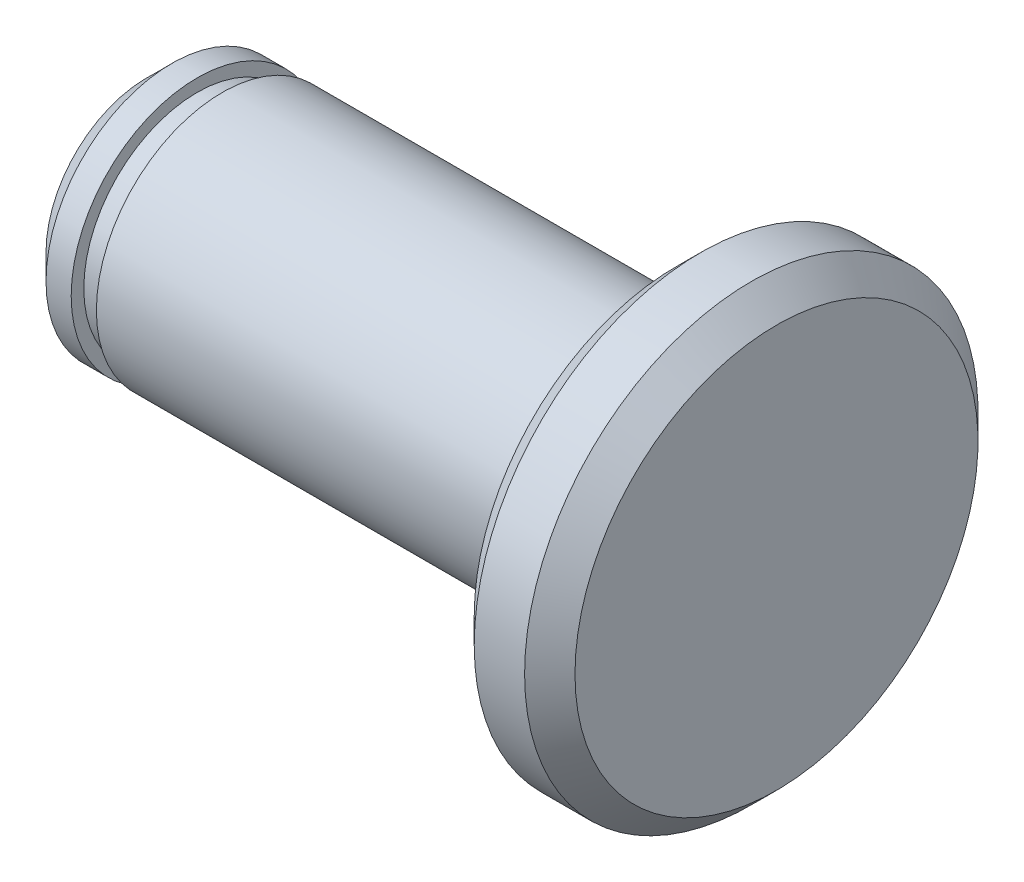
ISO-10303-21;
HEADER;
FILE_DESCRIPTION(('STEP AP214'),'2;1');
FILE_NAME('part.step','',(''),(''),'','','');
FILE_SCHEMA(('AUTOMOTIVE_DESIGN { 1 0 10303 214 1 1 1 1 }'));
ENDSEC;
DATA;
#1=APPLICATION_CONTEXT('core data for automotive mechanical design processes');
#2=APPLICATION_PROTOCOL_DEFINITION('international standard','automotive_design',2000,#1);
#3=PRODUCT_CONTEXT('',#1,'mechanical');
#4=PRODUCT('Part','Part','',(#3));
#5=PRODUCT_RELATED_PRODUCT_CATEGORY('part','',(#4));
#6=PRODUCT_DEFINITION_FORMATION('','',#4);
#7=PRODUCT_DEFINITION_CONTEXT('part definition',#1,'design');
#8=PRODUCT_DEFINITION('design','',#6,#7);
#9=PRODUCT_DEFINITION_SHAPE('','',#8);
#10=(LENGTH_UNIT() NAMED_UNIT(*) SI_UNIT(.MILLI.,.METRE.));
#11=(NAMED_UNIT(*) PLANE_ANGLE_UNIT() SI_UNIT($,.RADIAN.));
#12=(NAMED_UNIT(*) SI_UNIT($,.STERADIAN.) SOLID_ANGLE_UNIT());
#13=UNCERTAINTY_MEASURE_WITH_UNIT(LENGTH_MEASURE(1.E-05),#10,'distance_accuracy_value','');
#14=(GEOMETRIC_REPRESENTATION_CONTEXT(3) GLOBAL_UNCERTAINTY_ASSIGNED_CONTEXT((#13)) GLOBAL_UNIT_ASSIGNED_CONTEXT((#10,
#11,#12)) REPRESENTATION_CONTEXT('',''));
#15=CARTESIAN_POINT('',(0.,0.,0.));
#16=DIRECTION('',(0.,0.,1.));
#17=DIRECTION('',(1.,0.,0.));
#18=AXIS2_PLACEMENT_3D('',#15,#16,#17);
#19=CARTESIAN_POINT('',(-21.,0.,0.));
#20=DIRECTION('',(-1.,0.,0.));
#21=DIRECTION('',(0.,0.,1.));
#22=AXIS2_PLACEMENT_3D('',#19,#20,#21);
#23=PLANE('',#22);
#24=CARTESIAN_POINT('',(-21.,0.,0.));
#25=DIRECTION('',(-1.,0.,0.));
#26=DIRECTION('',(0.,0.,1.));
#27=AXIS2_PLACEMENT_3D('',#24,#25,#26);
#28=CIRCLE('',#27,4.);
#29=CARTESIAN_POINT('',(-21.,0.,4.));
#30=VERTEX_POINT('',#29);
#31=EDGE_CURVE('E10',#30,#30,#28,.T.);
#32=ORIENTED_EDGE('',*,*,#31,.T.);
#33=EDGE_LOOP('',(#32));
#34=FACE_BOUND('',#33,.T.);
#35=ADVANCED_FACE('F39',(#34),#23,.T.);
#36=CARTESIAN_POINT('',(-21.,0.,0.));
#37=DIRECTION('',(1.,0.,0.));
#38=DIRECTION('',(0.,0.,-1.));
#39=AXIS2_PLACEMENT_3D('',#36,#37,#38);
#40=CONICAL_SURFACE('',#39,4.,0.785398163397448);
#41=CARTESIAN_POINT('',(-20.,0.,0.));
#42=DIRECTION('',(-1.,0.,0.));
#43=DIRECTION('',(0.,0.,1.));
#44=AXIS2_PLACEMENT_3D('',#41,#42,#43);
#45=CIRCLE('',#44,5.);
#46=CARTESIAN_POINT('',(-20.,0.,5.));
#47=VERTEX_POINT('',#46);
#48=EDGE_CURVE('E45',#47,#47,#45,.T.);
#49=ORIENTED_EDGE('',*,*,#48,.T.);
#50=EDGE_LOOP('',(#49));
#51=FACE_BOUND('',#50,.T.);
#52=ORIENTED_EDGE('',*,*,#31,.F.);
#53=EDGE_LOOP('',(#52));
#54=FACE_BOUND('',#53,.T.);
#55=ADVANCED_FACE('F92',(#51,#54),#40,.T.);
#56=CARTESIAN_POINT('',(-21.,0.,0.));
#57=DIRECTION('',(-1.,0.,0.));
#58=DIRECTION('',(0.,0.,1.));
#59=AXIS2_PLACEMENT_3D('',#56,#57,#58);
#60=CYLINDRICAL_SURFACE('',#59,5.);
#61=CARTESIAN_POINT('',(-19.,0.,0.));
#62=DIRECTION('',(-1.,0.,0.));
#63=DIRECTION('',(0.,0.,1.));
#64=AXIS2_PLACEMENT_3D('',#61,#62,#63);
#65=CIRCLE('',#64,5.);
#66=CARTESIAN_POINT('',(-19.,0.,5.));
#67=VERTEX_POINT('',#66);
#68=EDGE_CURVE('E49',#67,#67,#65,.T.);
#69=ORIENTED_EDGE('',*,*,#68,.T.);
#70=EDGE_LOOP('',(#69));
#71=FACE_BOUND('',#70,.T.);
#72=ORIENTED_EDGE('',*,*,#48,.F.);
#73=EDGE_LOOP('',(#72));
#74=FACE_BOUND('',#73,.T.);
#75=ADVANCED_FACE('F96',(#71,#74),#60,.T.);
#76=CARTESIAN_POINT('',(-19.,0.,5.));
#77=DIRECTION('',(1.,0.,0.));
#78=DIRECTION('',(0.,0.,-1.));
#79=AXIS2_PLACEMENT_3D('',#76,#77,#78);
#80=PLANE('',#79);
#81=CARTESIAN_POINT('',(-19.,0.,0.));
#82=DIRECTION('',(-1.,0.,0.));
#83=DIRECTION('',(0.,0.,1.));
#84=AXIS2_PLACEMENT_3D('',#81,#82,#83);
#85=CIRCLE('',#84,4.5);
#86=CARTESIAN_POINT('',(-19.,0.,4.5));
#87=VERTEX_POINT('',#86);
#88=EDGE_CURVE('E53',#87,#87,#85,.T.);
#89=ORIENTED_EDGE('',*,*,#88,.T.);
#90=EDGE_LOOP('',(#89));
#91=FACE_BOUND('',#90,.T.);
#92=ORIENTED_EDGE('',*,*,#68,.F.);
#93=EDGE_LOOP('',(#92));
#94=FACE_BOUND('',#93,.T.);
#95=ADVANCED_FACE('F100',(#91,#94),#80,.T.);
#96=CARTESIAN_POINT('',(-21.,0.,0.));
#97=DIRECTION('',(-1.,0.,0.));
#98=DIRECTION('',(0.,0.,1.));
#99=AXIS2_PLACEMENT_3D('',#96,#97,#98);
#100=CYLINDRICAL_SURFACE('',#99,4.5);
#101=CARTESIAN_POINT('',(-18.,0.,0.));
#102=DIRECTION('',(-1.,0.,0.));
#103=DIRECTION('',(0.,0.,1.));
#104=AXIS2_PLACEMENT_3D('',#101,#102,#103);
#105=CIRCLE('',#104,4.5);
#106=CARTESIAN_POINT('',(-18.,0.,4.5));
#107=VERTEX_POINT('',#106);
#108=EDGE_CURVE('E58',#107,#107,#105,.T.);
#109=ORIENTED_EDGE('',*,*,#108,.T.);
#110=EDGE_LOOP('',(#109));
#111=FACE_BOUND('',#110,.T.);
#112=ORIENTED_EDGE('',*,*,#88,.F.);
#113=EDGE_LOOP('',(#112));
#114=FACE_BOUND('',#113,.T.);
#115=ADVANCED_FACE('F107',(#111,#114),#100,.T.);
#116=CARTESIAN_POINT('',(-18.,0.,4.5));
#117=DIRECTION('',(-1.,0.,0.));
#118=DIRECTION('',(0.,0.,1.));
#119=AXIS2_PLACEMENT_3D('',#116,#117,#118);
#120=PLANE('',#119);
#121=CARTESIAN_POINT('',(-18.,0.,0.));
#122=DIRECTION('',(-1.,0.,0.));
#123=DIRECTION('',(0.,0.,1.));
#124=AXIS2_PLACEMENT_3D('',#121,#122,#123);
#125=CIRCLE('',#124,5.);
#126=CARTESIAN_POINT('',(-18.,0.,5.));
#127=VERTEX_POINT('',#126);
#128=EDGE_CURVE('E61',#127,#127,#125,.T.);
#129=ORIENTED_EDGE('',*,*,#128,.T.);
#130=EDGE_LOOP('',(#129));
#131=FACE_BOUND('',#130,.T.);
#132=ORIENTED_EDGE('',*,*,#108,.F.);
#133=EDGE_LOOP('',(#132));
#134=FACE_BOUND('',#133,.T.);
#135=ADVANCED_FACE('F111',(#131,#134),#120,.T.);
#136=CARTESIAN_POINT('',(-21.,0.,0.));
#137=DIRECTION('',(-1.,0.,0.));
#138=DIRECTION('',(0.,0.,1.));
#139=AXIS2_PLACEMENT_3D('',#136,#137,#138);
#140=CYLINDRICAL_SURFACE('',#139,5.);
#141=CARTESIAN_POINT('',(0.,0.,0.));
#142=DIRECTION('',(-1.,0.,0.));
#143=DIRECTION('',(0.,0.,1.));
#144=AXIS2_PLACEMENT_3D('',#141,#142,#143);
#145=CIRCLE('',#144,5.);
#146=CARTESIAN_POINT('',(0.,0.,5.));
#147=VERTEX_POINT('',#146);
#148=EDGE_CURVE('E64',#147,#147,#145,.T.);
#149=ORIENTED_EDGE('',*,*,#148,.T.);
#150=EDGE_LOOP('',(#149));
#151=FACE_BOUND('',#150,.T.);
#152=ORIENTED_EDGE('',*,*,#128,.F.);
#153=EDGE_LOOP('',(#152));
#154=FACE_BOUND('',#153,.T.);
#155=ADVANCED_FACE('F115',(#151,#154),#140,.T.);
#156=CARTESIAN_POINT('',(0.,0.,8.));
#157=DIRECTION('',(-1.,0.,0.));
#158=DIRECTION('',(0.,0.,1.));
#159=AXIS2_PLACEMENT_3D('',#156,#157,#158);
#160=PLANE('',#159);
#161=CARTESIAN_POINT('',(0.,0.,0.));
#162=DIRECTION('',(-1.,0.,0.));
#163=DIRECTION('',(0.,0.,1.));
#164=AXIS2_PLACEMENT_3D('',#161,#162,#163);
#165=CIRCLE('',#164,8.);
#166=CARTESIAN_POINT('',(0.,0.,8.));
#167=VERTEX_POINT('',#166);
#168=EDGE_CURVE('E67',#167,#167,#165,.T.);
#169=ORIENTED_EDGE('',*,*,#168,.T.);
#170=EDGE_LOOP('',(#169));
#171=FACE_BOUND('',#170,.T.);
#172=ORIENTED_EDGE('',*,*,#148,.F.);
#173=EDGE_LOOP('',(#172));
#174=FACE_BOUND('',#173,.T.);
#175=ADVANCED_FACE('F119',(#171,#174),#160,.T.);
#176=CARTESIAN_POINT('',(0.,0.,0.));
#177=DIRECTION('',(1.,0.,0.));
#178=DIRECTION('',(0.,0.,-1.));
#179=AXIS2_PLACEMENT_3D('',#176,#177,#178);
#180=CONICAL_SURFACE('',#179,8.,0.785398163397447);
#181=CARTESIAN_POINT('',(1.,0.,0.));
#182=DIRECTION('',(-1.,0.,0.));
#183=DIRECTION('',(0.,0.,1.));
#184=AXIS2_PLACEMENT_3D('',#181,#182,#183);
#185=CIRCLE('',#184,9.);
#186=CARTESIAN_POINT('',(1.,0.,9.));
#187=VERTEX_POINT('',#186);
#188=EDGE_CURVE('E70',#187,#187,#185,.T.);
#189=ORIENTED_EDGE('',*,*,#188,.T.);
#190=EDGE_LOOP('',(#189));
#191=FACE_BOUND('',#190,.T.);
#192=ORIENTED_EDGE('',*,*,#168,.F.);
#193=EDGE_LOOP('',(#192));
#194=FACE_BOUND('',#193,.T.);
#195=ADVANCED_FACE('F123',(#191,#194),#180,.T.);
#196=CARTESIAN_POINT('',(-21.,0.,0.));
#197=DIRECTION('',(-1.,0.,0.));
#198=DIRECTION('',(0.,0.,1.));
#199=AXIS2_PLACEMENT_3D('',#196,#197,#198);
#200=CYLINDRICAL_SURFACE('',#199,9.);
#201=CARTESIAN_POINT('',(3.,0.,0.));
#202=DIRECTION('',(-1.,0.,0.));
#203=DIRECTION('',(0.,0.,1.));
#204=AXIS2_PLACEMENT_3D('',#201,#202,#203);
#205=CIRCLE('',#204,9.);
#206=CARTESIAN_POINT('',(3.,0.,9.));
#207=VERTEX_POINT('',#206);
#208=EDGE_CURVE('E73',#207,#207,#205,.T.);
#209=ORIENTED_EDGE('',*,*,#208,.T.);
#210=EDGE_LOOP('',(#209));
#211=FACE_BOUND('',#210,.T.);
#212=ORIENTED_EDGE('',*,*,#188,.F.);
#213=EDGE_LOOP('',(#212));
#214=FACE_BOUND('',#213,.T.);
#215=ADVANCED_FACE('F89',(#211,#214),#200,.T.);
#216=CARTESIAN_POINT('',(3.,0.,0.));
#217=DIRECTION('',(-1.,0.,0.));
#218=DIRECTION('',(0.,0.,1.));
#219=AXIS2_PLACEMENT_3D('',#216,#217,#218);
#220=CONICAL_SURFACE('',#219,9.,0.785398163397447);
#221=CARTESIAN_POINT('',(4.,0.,0.));
#222=DIRECTION('',(-1.,0.,0.));
#223=DIRECTION('',(0.,0.,1.));
#224=AXIS2_PLACEMENT_3D('',#221,#222,#223);
#225=CIRCLE('',#224,8.);
#226=CARTESIAN_POINT('',(4.,0.,8.));
#227=VERTEX_POINT('',#226);
#228=EDGE_CURVE('E76',#227,#227,#225,.T.);
#229=ORIENTED_EDGE('',*,*,#228,.T.);
#230=EDGE_LOOP('',(#229));
#231=FACE_BOUND('',#230,.T.);
#232=ORIENTED_EDGE('',*,*,#208,.F.);
#233=EDGE_LOOP('',(#232));
#234=FACE_BOUND('',#233,.T.);
#235=ADVANCED_FACE('F80',(#231,#234),#220,.T.);
#236=CARTESIAN_POINT('',(4.,0.,8.));
#237=DIRECTION('',(1.,0.,0.));
#238=DIRECTION('',(0.,0.,-1.));
#239=AXIS2_PLACEMENT_3D('',#236,#237,#238);
#240=PLANE('',#239);
#241=ORIENTED_EDGE('',*,*,#228,.F.);
#242=EDGE_LOOP('',(#241));
#243=FACE_BOUND('',#242,.T.);
#244=ADVANCED_FACE('F83',(#243),#240,.T.);
#245=CLOSED_SHELL('',(#35,#55,#75,#95,#115,#135,#155,#175,#195,#215,#235,#244));
#246=MANIFOLD_SOLID_BREP('B2',#245);
#247=ADVANCED_BREP_SHAPE_REPRESENTATION('',(#18,#246),#14);
#248=SHAPE_DEFINITION_REPRESENTATION(#9,#247);
ENDSEC;
END-ISO-10303-21;
